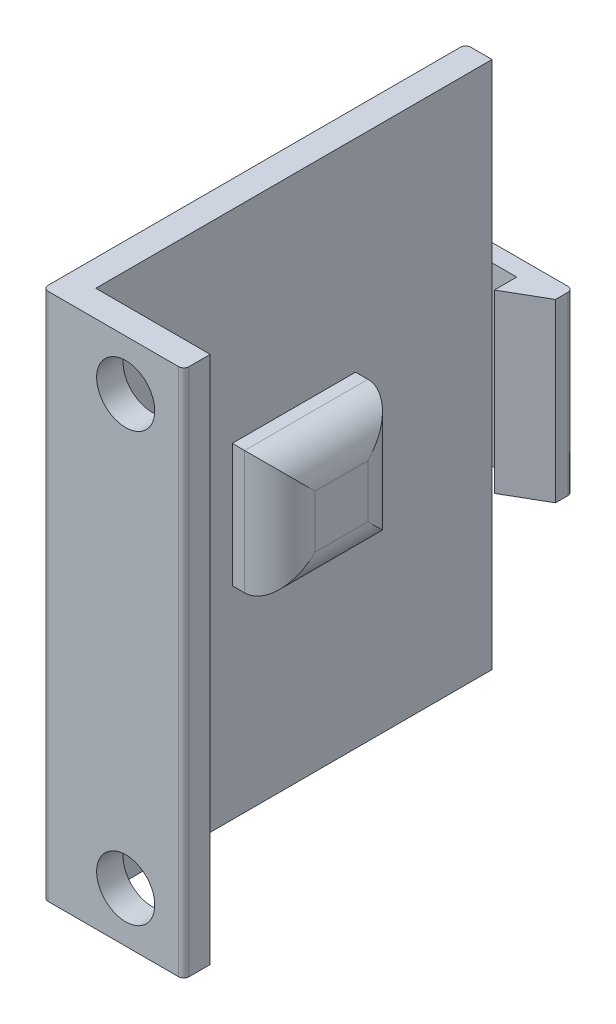
ISO-10303-21;
HEADER;
FILE_DESCRIPTION(('STEP AP214'),'2;1');
FILE_NAME('part.step','',(''),(''),'','','');
FILE_SCHEMA(('AUTOMOTIVE_DESIGN { 1 0 10303 214 1 1 1 1 }'));
ENDSEC;
DATA;
#1=APPLICATION_CONTEXT('core data for automotive mechanical design processes');
#2=APPLICATION_PROTOCOL_DEFINITION('international standard','automotive_design',2000,#1);
#3=PRODUCT_CONTEXT('',#1,'mechanical');
#4=PRODUCT('Part','Part','',(#3));
#5=PRODUCT_RELATED_PRODUCT_CATEGORY('part','',(#4));
#6=PRODUCT_DEFINITION_FORMATION('','',#4);
#7=PRODUCT_DEFINITION_CONTEXT('part definition',#1,'design');
#8=PRODUCT_DEFINITION('design','',#6,#7);
#9=PRODUCT_DEFINITION_SHAPE('','',#8);
#10=(LENGTH_UNIT() NAMED_UNIT(*) SI_UNIT(.MILLI.,.METRE.));
#11=(NAMED_UNIT(*) PLANE_ANGLE_UNIT() SI_UNIT($,.RADIAN.));
#12=(NAMED_UNIT(*) SI_UNIT($,.STERADIAN.) SOLID_ANGLE_UNIT());
#13=UNCERTAINTY_MEASURE_WITH_UNIT(LENGTH_MEASURE(1.E-05),#10,'distance_accuracy_value','');
#14=(GEOMETRIC_REPRESENTATION_CONTEXT(3) GLOBAL_UNCERTAINTY_ASSIGNED_CONTEXT((#13)) GLOBAL_UNIT_ASSIGNED_CONTEXT((#10,
#11,#12)) REPRESENTATION_CONTEXT('',''));
#15=CARTESIAN_POINT('',(0.,0.,0.));
#16=DIRECTION('',(0.,0.,1.));
#17=DIRECTION('',(1.,0.,0.));
#18=AXIS2_PLACEMENT_3D('',#15,#16,#17);
#19=CARTESIAN_POINT('',(-3.6,0.,0.));
#20=DIRECTION('',(-1.,0.,0.));
#21=DIRECTION('',(0.,0.,1.));
#22=AXIS2_PLACEMENT_3D('',#19,#20,#21);
#23=PLANE('',#22);
#24=DIRECTION('',(0.,1.,0.));
#25=VECTOR('',#24,1.);
#26=CARTESIAN_POINT('',(-3.6,0.,0.));
#27=LINE('',#26,#25);
#28=CARTESIAN_POINT('',(-3.6,-15.,0.));
#29=VERTEX_POINT('',#28);
#30=CARTESIAN_POINT('',(-3.6,-5.,0.));
#31=VERTEX_POINT('',#30);
#32=EDGE_CURVE('E270',#29,#31,#27,.T.);
#33=ORIENTED_EDGE('',*,*,#32,.T.);
#34=DIRECTION('',(0.,1.,0.));
#35=VECTOR('',#34,1.);
#36=CARTESIAN_POINT('',(-3.6,-5.,0.));
#37=LINE('',#36,#35);
#38=CARTESIAN_POINT('',(-3.6,5.,0.));
#39=VERTEX_POINT('',#38);
#40=EDGE_CURVE('E307',#31,#39,#37,.T.);
#41=ORIENTED_EDGE('',*,*,#40,.T.);
#42=CARTESIAN_POINT('',(-3.6,15.,0.));
#43=VERTEX_POINT('',#42);
#44=EDGE_CURVE('E286',#39,#43,#27,.T.);
#45=ORIENTED_EDGE('',*,*,#44,.T.);
#46=DIRECTION('',(0.,0.,1.));
#47=VECTOR('',#46,1.);
#48=CARTESIAN_POINT('',(-3.6,15.,0.));
#49=LINE('',#48,#47);
#50=CARTESIAN_POINT('',(-3.6,15.,22.5));
#51=VERTEX_POINT('',#50);
#52=EDGE_CURVE('E284',#43,#51,#49,.T.);
#53=ORIENTED_EDGE('',*,*,#52,.T.);
#54=DIRECTION('',(0.,1.,0.));
#55=VECTOR('',#54,1.);
#56=CARTESIAN_POINT('',(-3.6,0.,22.5));
#57=LINE('',#56,#55);
#58=CARTESIAN_POINT('',(-3.6,-15.,22.5));
#59=VERTEX_POINT('',#58);
#60=EDGE_CURVE('E281',#59,#51,#57,.T.);
#61=ORIENTED_EDGE('',*,*,#60,.F.);
#62=DIRECTION('',(0.,0.,1.));
#63=VECTOR('',#62,1.);
#64=CARTESIAN_POINT('',(-3.6,-15.,0.));
#65=LINE('',#64,#63);
#66=EDGE_CURVE('E265',#29,#59,#65,.T.);
#67=ORIENTED_EDGE('',*,*,#66,.F.);
#68=EDGE_LOOP('',(#33,#41,#45,#53,#61,#67));
#69=FACE_BOUND('',#68,.T.);
#70=DIRECTION('',(0.,0.,-1.));
#71=VECTOR('',#70,1.);
#72=CARTESIAN_POINT('',(-3.6,-3.5,14.75));
#73=LINE('',#72,#71);
#74=CARTESIAN_POINT('',(-3.6,-3.5,14.75));
#75=VERTEX_POINT('',#74);
#76=CARTESIAN_POINT('',(-3.6,-3.5,7.75));
#77=VERTEX_POINT('',#76);
#78=EDGE_CURVE('E206',#75,#77,#73,.T.);
#79=ORIENTED_EDGE('',*,*,#78,.F.);
#80=DIRECTION('',(0.,-1.,0.));
#81=VECTOR('',#80,1.);
#82=CARTESIAN_POINT('',(-3.6,3.5,14.75));
#83=LINE('',#82,#81);
#84=CARTESIAN_POINT('',(-3.6,3.5,14.75));
#85=VERTEX_POINT('',#84);
#86=EDGE_CURVE('E213',#85,#75,#83,.T.);
#87=ORIENTED_EDGE('',*,*,#86,.F.);
#88=DIRECTION('',(0.,0.,-1.));
#89=VECTOR('',#88,1.);
#90=CARTESIAN_POINT('',(-3.6,3.5,14.75));
#91=LINE('',#90,#89);
#92=CARTESIAN_POINT('',(-3.6,3.5,7.75));
#93=VERTEX_POINT('',#92);
#94=EDGE_CURVE('E224',#85,#93,#91,.T.);
#95=ORIENTED_EDGE('',*,*,#94,.T.);
#96=DIRECTION('',(0.,-1.,0.));
#97=VECTOR('',#96,1.);
#98=CARTESIAN_POINT('',(-3.6,3.5,7.75));
#99=LINE('',#98,#97);
#100=EDGE_CURVE('E221',#93,#77,#99,.T.);
#101=ORIENTED_EDGE('',*,*,#100,.T.);
#102=EDGE_LOOP('',(#79,#87,#95,#101));
#103=FACE_BOUND('',#102,.T.);
#104=ADVANCED_FACE('F35',(#69,#103),#23,.F.);
#105=CARTESIAN_POINT('',(-2.2,-5.,1.27017059221719));
#106=DIRECTION('',(0.500000000000004,0.,0.866025403784436));
#107=DIRECTION('',(0.866025403784436,0.,-0.500000000000004));
#108=AXIS2_PLACEMENT_3D('',#105,#106,#107);
#109=PLANE('',#108);
#110=DIRECTION('',(0.,1.,0.));
#111=VECTOR('',#110,1.);
#112=CARTESIAN_POINT('',(0.,-5.,0.));
#113=LINE('',#112,#111);
#114=CARTESIAN_POINT('',(0.,-5.,0.));
#115=VERTEX_POINT('',#114);
#116=CARTESIAN_POINT('',(0.,5.,0.));
#117=VERTEX_POINT('',#116);
#118=EDGE_CURVE('E327',#115,#117,#113,.T.);
#119=ORIENTED_EDGE('',*,*,#118,.T.);
#120=DIRECTION('',(0.866025403784436,0.,-0.500000000000004));
#121=VECTOR('',#120,1.);
#122=CARTESIAN_POINT('',(-2.2,5.,1.27017059221719));
#123=LINE('',#122,#121);
#124=CARTESIAN_POINT('',(-2.2,5.,1.27017059221719));
#125=VERTEX_POINT('',#124);
#126=EDGE_CURVE('E315',#125,#117,#123,.T.);
#127=ORIENTED_EDGE('',*,*,#126,.F.);
#128=DIRECTION('',(0.,1.,0.));
#129=VECTOR('',#128,1.);
#130=CARTESIAN_POINT('',(-2.2,-5.,1.27017059221719));
#131=LINE('',#130,#129);
#132=CARTESIAN_POINT('',(-2.2,-5.,1.27017059221719));
#133=VERTEX_POINT('',#132);
#134=EDGE_CURVE('E328',#133,#125,#131,.T.);
#135=ORIENTED_EDGE('',*,*,#134,.F.);
#136=DIRECTION('',(0.866025403784436,0.,-0.500000000000004));
#137=VECTOR('',#136,1.);
#138=CARTESIAN_POINT('',(-2.2,-5.,1.27017059221719));
#139=LINE('',#138,#137);
#140=EDGE_CURVE('E321',#133,#115,#139,.T.);
#141=ORIENTED_EDGE('',*,*,#140,.T.);
#142=EDGE_LOOP('',(#119,#127,#135,#141));
#143=FACE_BOUND('',#142,.T.);
#144=ADVANCED_FACE('F437',(#143),#109,.T.);
#145=CARTESIAN_POINT('',(-2.2,-5.,0.));
#146=DIRECTION('',(-1.,0.,0.));
#147=DIRECTION('',(0.,0.,1.));
#148=AXIS2_PLACEMENT_3D('',#145,#146,#147);
#149=PLANE('',#148);
#150=ORIENTED_EDGE('',*,*,#134,.T.);
#151=DIRECTION('',(0.,0.,1.));
#152=VECTOR('',#151,1.);
#153=CARTESIAN_POINT('',(-2.2,5.,0.));
#154=LINE('',#153,#152);
#155=CARTESIAN_POINT('',(-2.2,5.,0.));
#156=VERTEX_POINT('',#155);
#157=EDGE_CURVE('E318',#156,#125,#154,.T.);
#158=ORIENTED_EDGE('',*,*,#157,.F.);
#159=DIRECTION('',(0.,1.,0.));
#160=VECTOR('',#159,1.);
#161=CARTESIAN_POINT('',(-2.2,-5.,0.));
#162=LINE('',#161,#160);
#163=CARTESIAN_POINT('',(-2.2,-5.,0.));
#164=VERTEX_POINT('',#163);
#165=EDGE_CURVE('E331',#164,#156,#162,.T.);
#166=ORIENTED_EDGE('',*,*,#165,.F.);
#167=DIRECTION('',(0.,0.,1.));
#168=VECTOR('',#167,1.);
#169=CARTESIAN_POINT('',(-2.2,-5.,0.));
#170=LINE('',#169,#168);
#171=EDGE_CURVE('E324',#164,#133,#170,.T.);
#172=ORIENTED_EDGE('',*,*,#171,.T.);
#173=EDGE_LOOP('',(#150,#158,#166,#172));
#174=FACE_BOUND('',#173,.T.);
#175=ADVANCED_FACE('F443',(#174),#149,.T.);
#176=CARTESIAN_POINT('',(0.,-5.,0.));
#177=DIRECTION('',(0.,-1.,0.));
#178=DIRECTION('',(0.,0.,-1.));
#179=AXIS2_PLACEMENT_3D('',#176,#177,#178);
#180=PLANE('',#179);
#181=DIRECTION('',(-1.,0.,0.));
#182=VECTOR('',#181,1.);
#183=CARTESIAN_POINT('',(0.,-5.,-1.));
#184=LINE('',#183,#182);
#185=CARTESIAN_POINT('',(-0.3,-5.,-1.));
#186=VERTEX_POINT('',#185);
#187=CARTESIAN_POINT('',(-4.8,-5.,-0.999999999999999));
#188=VERTEX_POINT('',#187);
#189=EDGE_CURVE('E297',#186,#188,#184,.T.);
#190=ORIENTED_EDGE('',*,*,#189,.F.);
#191=CARTESIAN_POINT('',(-0.3,-5.,-0.7));
#192=DIRECTION('',(0.,-1.,0.));
#193=DIRECTION('',(0.,0.,-1.));
#194=AXIS2_PLACEMENT_3D('',#191,#192,#193);
#195=CIRCLE('',#194,0.3);
#196=CARTESIAN_POINT('',(0.,-5.,-0.7));
#197=VERTEX_POINT('',#196);
#198=EDGE_CURVE('E342',#186,#197,#195,.T.);
#199=ORIENTED_EDGE('',*,*,#198,.T.);
#200=DIRECTION('',(0.,0.,1.));
#201=VECTOR('',#200,1.);
#202=CARTESIAN_POINT('',(0.,-5.,-1.));
#203=LINE('',#202,#201);
#204=EDGE_CURVE('E313',#197,#115,#203,.T.);
#205=ORIENTED_EDGE('',*,*,#204,.T.);
#206=ORIENTED_EDGE('',*,*,#140,.F.);
#207=ORIENTED_EDGE('',*,*,#171,.F.);
#208=DIRECTION('',(-1.,0.,0.));
#209=VECTOR('',#208,1.);
#210=CARTESIAN_POINT('',(0.,-5.,0.));
#211=LINE('',#210,#209);
#212=EDGE_CURVE('E296',#164,#31,#211,.T.);
#213=ORIENTED_EDGE('',*,*,#212,.T.);
#214=DIRECTION('',(1.,0.,0.));
#215=VECTOR('',#214,1.);
#216=CARTESIAN_POINT('',(-5.1,-5.,0.));
#217=LINE('',#216,#215);
#218=CARTESIAN_POINT('',(-4.8,-5.,0.));
#219=VERTEX_POINT('',#218);
#220=EDGE_CURVE('E290',#219,#31,#217,.T.);
#221=ORIENTED_EDGE('',*,*,#220,.F.);
#222=CARTESIAN_POINT('',(-4.8,-5.,0.3));
#223=DIRECTION('',(0.,-1.,0.));
#224=DIRECTION('',(0.,0.,-1.));
#225=AXIS2_PLACEMENT_3D('',#222,#223,#224);
#226=CIRCLE('',#225,0.3);
#227=CARTESIAN_POINT('',(-5.1,-5.,0.300000000000001));
#228=VERTEX_POINT('',#227);
#229=EDGE_CURVE('E386',#219,#228,#226,.F.);
#230=ORIENTED_EDGE('',*,*,#229,.T.);
#231=DIRECTION('',(0.,0.,1.));
#232=VECTOR('',#231,1.);
#233=CARTESIAN_POINT('',(-5.1,-5.,0.));
#234=LINE('',#233,#232);
#235=CARTESIAN_POINT('',(-5.1,-5.,-0.7));
#236=VERTEX_POINT('',#235);
#237=EDGE_CURVE('E276',#236,#228,#234,.T.);
#238=ORIENTED_EDGE('',*,*,#237,.F.);
#239=CARTESIAN_POINT('',(-4.8,-5.,-0.7));
#240=DIRECTION('',(0.,-1.,0.));
#241=DIRECTION('',(0.,0.,-1.));
#242=AXIS2_PLACEMENT_3D('',#239,#240,#241);
#243=CIRCLE('',#242,0.3);
#244=EDGE_CURVE('E340',#236,#188,#243,.T.);
#245=ORIENTED_EDGE('',*,*,#244,.T.);
#246=EDGE_LOOP('',(#190,#199,#205,#206,#207,#213,#221,#230,#238,#245));
#247=FACE_BOUND('',#246,.T.);
#248=ADVANCED_FACE('F479',(#247),#180,.T.);
#249=CARTESIAN_POINT('',(0.,5.,0.));
#250=DIRECTION('',(0.,-1.,0.));
#251=DIRECTION('',(0.,0.,-1.));
#252=AXIS2_PLACEMENT_3D('',#249,#250,#251);
#253=PLANE('',#252);
#254=DIRECTION('',(0.,0.,1.));
#255=VECTOR('',#254,1.);
#256=CARTESIAN_POINT('',(0.,5.,-1.));
#257=LINE('',#256,#255);
#258=CARTESIAN_POINT('',(0.,5.,-0.7));
#259=VERTEX_POINT('',#258);
#260=EDGE_CURVE('E304',#259,#117,#257,.T.);
#261=ORIENTED_EDGE('',*,*,#260,.F.);
#262=CARTESIAN_POINT('',(-0.3,5.,-0.7));
#263=DIRECTION('',(0.,-1.,0.));
#264=DIRECTION('',(0.,0.,-1.));
#265=AXIS2_PLACEMENT_3D('',#262,#263,#264);
#266=CIRCLE('',#265,0.3);
#267=CARTESIAN_POINT('',(-0.3,5.,-1.));
#268=VERTEX_POINT('',#267);
#269=EDGE_CURVE('E348',#259,#268,#266,.F.);
#270=ORIENTED_EDGE('',*,*,#269,.T.);
#271=DIRECTION('',(1.,0.,0.));
#272=VECTOR('',#271,1.);
#273=CARTESIAN_POINT('',(0.,5.,-1.));
#274=LINE('',#273,#272);
#275=CARTESIAN_POINT('',(-4.8,5.,-0.999999999999999));
#276=VERTEX_POINT('',#275);
#277=EDGE_CURVE('E300',#276,#268,#274,.T.);
#278=ORIENTED_EDGE('',*,*,#277,.F.);
#279=CARTESIAN_POINT('',(-4.8,5.,-0.7));
#280=DIRECTION('',(0.,-1.,0.));
#281=DIRECTION('',(0.,0.,-1.));
#282=AXIS2_PLACEMENT_3D('',#279,#280,#281);
#283=CIRCLE('',#282,0.3);
#284=CARTESIAN_POINT('',(-5.1,5.,-0.7));
#285=VERTEX_POINT('',#284);
#286=EDGE_CURVE('E346',#276,#285,#283,.F.);
#287=ORIENTED_EDGE('',*,*,#286,.T.);
#288=DIRECTION('',(0.,0.,-1.));
#289=VECTOR('',#288,1.);
#290=CARTESIAN_POINT('',(-5.1,5.,0.));
#291=LINE('',#290,#289);
#292=CARTESIAN_POINT('',(-5.1,5.,0.300000000000001));
#293=VERTEX_POINT('',#292);
#294=EDGE_CURVE('E273',#293,#285,#291,.T.);
#295=ORIENTED_EDGE('',*,*,#294,.F.);
#296=CARTESIAN_POINT('',(-4.8,5.,0.3));
#297=DIRECTION('',(0.,-1.,0.));
#298=DIRECTION('',(0.,0.,-1.));
#299=AXIS2_PLACEMENT_3D('',#296,#297,#298);
#300=CIRCLE('',#299,0.3);
#301=CARTESIAN_POINT('',(-4.8,5.,0.));
#302=VERTEX_POINT('',#301);
#303=EDGE_CURVE('E389',#293,#302,#300,.T.);
#304=ORIENTED_EDGE('',*,*,#303,.T.);
#305=DIRECTION('',(1.,0.,0.));
#306=VECTOR('',#305,1.);
#307=CARTESIAN_POINT('',(-5.1,5.,0.));
#308=LINE('',#307,#306);
#309=EDGE_CURVE('E292',#302,#39,#308,.T.);
#310=ORIENTED_EDGE('',*,*,#309,.T.);
#311=DIRECTION('',(1.,0.,0.));
#312=VECTOR('',#311,1.);
#313=CARTESIAN_POINT('',(0.,5.,0.));
#314=LINE('',#313,#312);
#315=EDGE_CURVE('E301',#39,#156,#314,.T.);
#316=ORIENTED_EDGE('',*,*,#315,.T.);
#317=ORIENTED_EDGE('',*,*,#157,.T.);
#318=ORIENTED_EDGE('',*,*,#126,.T.);
#319=EDGE_LOOP('',(#261,#270,#278,#287,#295,#304,#310,#316,#317,#318));
#320=FACE_BOUND('',#319,.T.);
#321=ADVANCED_FACE('F475',(#320),#253,.F.);
#322=CARTESIAN_POINT('',(0.,-5.,-1.));
#323=DIRECTION('',(-1.,0.,0.));
#324=DIRECTION('',(0.,0.,1.));
#325=AXIS2_PLACEMENT_3D('',#322,#323,#324);
#326=PLANE('',#325);
#327=ORIENTED_EDGE('',*,*,#204,.F.);
#328=DIRECTION('',(0.,-1.,0.));
#329=VECTOR('',#328,1.);
#330=CARTESIAN_POINT('',(0.,-5.,-0.7));
#331=LINE('',#330,#329);
#332=EDGE_CURVE('E344',#197,#259,#331,.F.);
#333=ORIENTED_EDGE('',*,*,#332,.T.);
#334=ORIENTED_EDGE('',*,*,#260,.T.);
#335=ORIENTED_EDGE('',*,*,#118,.F.);
#336=EDGE_LOOP('',(#327,#333,#334,#335));
#337=FACE_BOUND('',#336,.T.);
#338=ADVANCED_FACE('F468',(#337),#326,.F.);
#339=CARTESIAN_POINT('',(0.,0.,-1.));
#340=DIRECTION('',(0.,0.,1.));
#341=DIRECTION('',(1.,0.,0.));
#342=AXIS2_PLACEMENT_3D('',#339,#340,#341);
#343=PLANE('',#342);
#344=ORIENTED_EDGE('',*,*,#277,.T.);
#345=DIRECTION('',(0.,-1.,0.));
#346=VECTOR('',#345,1.);
#347=CARTESIAN_POINT('',(-0.3,0.,-1.));
#348=LINE('',#347,#346);
#349=EDGE_CURVE('E337',#268,#186,#348,.T.);
#350=ORIENTED_EDGE('',*,*,#349,.T.);
#351=ORIENTED_EDGE('',*,*,#189,.T.);
#352=DIRECTION('',(0.,-1.,0.));
#353=VECTOR('',#352,1.);
#354=CARTESIAN_POINT('',(-4.8,5.,-0.999999999999999));
#355=LINE('',#354,#353);
#356=EDGE_CURVE('E330',#188,#276,#355,.F.);
#357=ORIENTED_EDGE('',*,*,#356,.T.);
#358=EDGE_LOOP('',(#344,#350,#351,#357));
#359=FACE_BOUND('',#358,.T.);
#360=ADVANCED_FACE('F465',(#359),#343,.F.);
#361=CARTESIAN_POINT('',(0.,0.,0.));
#362=DIRECTION('',(0.,0.,1.));
#363=DIRECTION('',(1.,0.,0.));
#364=AXIS2_PLACEMENT_3D('',#361,#362,#363);
#365=PLANE('',#364);
#366=ORIENTED_EDGE('',*,*,#212,.F.);
#367=ORIENTED_EDGE('',*,*,#165,.T.);
#368=ORIENTED_EDGE('',*,*,#315,.F.);
#369=ORIENTED_EDGE('',*,*,#40,.F.);
#370=EDGE_LOOP('',(#366,#367,#368,#369));
#371=FACE_BOUND('',#370,.T.);
#372=ADVANCED_FACE('F463',(#371),#365,.T.);
#373=CARTESIAN_POINT('',(-5.1,-15.,0.));
#374=DIRECTION('',(0.,1.,0.));
#375=DIRECTION('',(0.,0.,1.));
#376=AXIS2_PLACEMENT_3D('',#373,#374,#375);
#377=PLANE('',#376);
#378=DIRECTION('',(0.,0.,1.));
#379=VECTOR('',#378,1.);
#380=CARTESIAN_POINT('',(-5.1,-15.,0.));
#381=LINE('',#380,#379);
#382=CARTESIAN_POINT('',(-5.1,-15.,0.300000000000001));
#383=VERTEX_POINT('',#382);
#384=CARTESIAN_POINT('',(-5.1,-15.,23.7));
#385=VERTEX_POINT('',#384);
#386=EDGE_CURVE('E266',#383,#385,#381,.T.);
#387=ORIENTED_EDGE('',*,*,#386,.F.);
#388=CARTESIAN_POINT('',(-4.8,-15.,0.3));
#389=DIRECTION('',(0.,1.,0.));
#390=DIRECTION('',(0.,0.,1.));
#391=AXIS2_PLACEMENT_3D('',#388,#389,#390);
#392=CIRCLE('',#391,0.3);
#393=CARTESIAN_POINT('',(-4.8,-15.,0.));
#394=VERTEX_POINT('',#393);
#395=EDGE_CURVE('E367',#383,#394,#392,.F.);
#396=ORIENTED_EDGE('',*,*,#395,.T.);
#397=DIRECTION('',(1.,0.,0.));
#398=VECTOR('',#397,1.);
#399=CARTESIAN_POINT('',(-5.1,-15.,0.));
#400=LINE('',#399,#398);
#401=EDGE_CURVE('E278',#394,#29,#400,.T.);
#402=ORIENTED_EDGE('',*,*,#401,.T.);
#403=ORIENTED_EDGE('',*,*,#66,.T.);
#404=DIRECTION('',(1.,0.,0.));
#405=VECTOR('',#404,1.);
#406=CARTESIAN_POINT('',(0.,-15.,22.5));
#407=LINE('',#406,#405);
#408=CARTESIAN_POINT('',(2.9,-15.,22.5));
#409=VERTEX_POINT('',#408);
#410=EDGE_CURVE('E234',#59,#409,#407,.T.);
#411=ORIENTED_EDGE('',*,*,#410,.T.);
#412=DIRECTION('',(0.,0.,-1.));
#413=VECTOR('',#412,1.);
#414=CARTESIAN_POINT('',(2.9,-15.,24.));
#415=LINE('',#414,#413);
#416=CARTESIAN_POINT('',(2.9,-15.,23.7));
#417=VERTEX_POINT('',#416);
#418=EDGE_CURVE('E263',#417,#409,#415,.T.);
#419=ORIENTED_EDGE('',*,*,#418,.F.);
#420=CARTESIAN_POINT('',(2.6,-15.,23.7));
#421=DIRECTION('',(0.,1.,0.));
#422=DIRECTION('',(0.,0.,1.));
#423=AXIS2_PLACEMENT_3D('',#420,#421,#422);
#424=CIRCLE('',#423,0.3);
#425=CARTESIAN_POINT('',(2.6,-15.,24.));
#426=VERTEX_POINT('',#425);
#427=EDGE_CURVE('E365',#417,#426,#424,.F.);
#428=ORIENTED_EDGE('',*,*,#427,.T.);
#429=DIRECTION('',(1.,0.,0.));
#430=VECTOR('',#429,1.);
#431=CARTESIAN_POINT('',(0.,-15.,24.));
#432=LINE('',#431,#430);
#433=CARTESIAN_POINT('',(-4.8,-15.,24.));
#434=VERTEX_POINT('',#433);
#435=EDGE_CURVE('E235',#434,#426,#432,.T.);
#436=ORIENTED_EDGE('',*,*,#435,.F.);
#437=CARTESIAN_POINT('',(-4.8,-15.,23.7));
#438=DIRECTION('',(0.,1.,0.));
#439=DIRECTION('',(0.,0.,1.));
#440=AXIS2_PLACEMENT_3D('',#437,#438,#439);
#441=CIRCLE('',#440,0.3);
#442=EDGE_CURVE('E363',#434,#385,#441,.F.);
#443=ORIENTED_EDGE('',*,*,#442,.T.);
#444=EDGE_LOOP('',(#387,#396,#402,#403,#411,#419,#428,#436,#443));
#445=FACE_BOUND('',#444,.T.);
#446=ADVANCED_FACE('F459',(#445),#377,.F.);
#447=CARTESIAN_POINT('',(-5.1,15.,0.));
#448=DIRECTION('',(0.,1.,0.));
#449=DIRECTION('',(0.,0.,1.));
#450=AXIS2_PLACEMENT_3D('',#447,#448,#449);
#451=PLANE('',#450);
#452=DIRECTION('',(1.,0.,0.));
#453=VECTOR('',#452,1.);
#454=CARTESIAN_POINT('',(-5.1,15.,0.));
#455=LINE('',#454,#453);
#456=CARTESIAN_POINT('',(-4.8,15.,0.));
#457=VERTEX_POINT('',#456);
#458=EDGE_CURVE('E294',#457,#43,#455,.T.);
#459=ORIENTED_EDGE('',*,*,#458,.F.);
#460=CARTESIAN_POINT('',(-4.8,15.,0.3));
#461=DIRECTION('',(0.,1.,0.));
#462=DIRECTION('',(0.,0.,1.));
#463=AXIS2_PLACEMENT_3D('',#460,#461,#462);
#464=CIRCLE('',#463,0.3);
#465=CARTESIAN_POINT('',(-5.1,15.,0.300000000000001));
#466=VERTEX_POINT('',#465);
#467=EDGE_CURVE('E376',#457,#466,#464,.T.);
#468=ORIENTED_EDGE('',*,*,#467,.T.);
#469=DIRECTION('',(0.,0.,1.));
#470=VECTOR('',#469,1.);
#471=CARTESIAN_POINT('',(-5.1,15.,0.));
#472=LINE('',#471,#470);
#473=CARTESIAN_POINT('',(-5.1,15.,23.7));
#474=VERTEX_POINT('',#473);
#475=EDGE_CURVE('E269',#466,#474,#472,.T.);
#476=ORIENTED_EDGE('',*,*,#475,.T.);
#477=CARTESIAN_POINT('',(-4.8,15.,23.7));
#478=DIRECTION('',(0.,1.,0.));
#479=DIRECTION('',(0.,0.,1.));
#480=AXIS2_PLACEMENT_3D('',#477,#478,#479);
#481=CIRCLE('',#480,0.3);
#482=CARTESIAN_POINT('',(-4.8,15.,24.));
#483=VERTEX_POINT('',#482);
#484=EDGE_CURVE('E372',#474,#483,#481,.T.);
#485=ORIENTED_EDGE('',*,*,#484,.T.);
#486=DIRECTION('',(1.,0.,0.));
#487=VECTOR('',#486,1.);
#488=CARTESIAN_POINT('',(0.,15.,24.));
#489=LINE('',#488,#487);
#490=CARTESIAN_POINT('',(2.6,15.,24.));
#491=VERTEX_POINT('',#490);
#492=EDGE_CURVE('E238',#483,#491,#489,.T.);
#493=ORIENTED_EDGE('',*,*,#492,.T.);
#494=CARTESIAN_POINT('',(2.6,15.,23.7));
#495=DIRECTION('',(0.,1.,0.));
#496=DIRECTION('',(0.,0.,1.));
#497=AXIS2_PLACEMENT_3D('',#494,#495,#496);
#498=CIRCLE('',#497,0.3);
#499=CARTESIAN_POINT('',(2.9,15.,23.7));
#500=VERTEX_POINT('',#499);
#501=EDGE_CURVE('E374',#491,#500,#498,.T.);
#502=ORIENTED_EDGE('',*,*,#501,.T.);
#503=DIRECTION('',(0.,0.,-1.));
#504=VECTOR('',#503,1.);
#505=CARTESIAN_POINT('',(2.9,15.,24.));
#506=LINE('',#505,#504);
#507=CARTESIAN_POINT('',(2.9,15.,22.5));
#508=VERTEX_POINT('',#507);
#509=EDGE_CURVE('E248',#500,#508,#506,.T.);
#510=ORIENTED_EDGE('',*,*,#509,.T.);
#511=DIRECTION('',(1.,0.,0.));
#512=VECTOR('',#511,1.);
#513=CARTESIAN_POINT('',(0.,15.,22.5));
#514=LINE('',#513,#512);
#515=EDGE_CURVE('E254',#51,#508,#514,.T.);
#516=ORIENTED_EDGE('',*,*,#515,.F.);
#517=ORIENTED_EDGE('',*,*,#52,.F.);
#518=EDGE_LOOP('',(#459,#468,#476,#485,#493,#502,#510,#516,#517));
#519=FACE_BOUND('',#518,.T.);
#520=ADVANCED_FACE('F456',(#519),#451,.T.);
#521=CARTESIAN_POINT('',(-5.1,0.,0.));
#522=DIRECTION('',(0.,0.,-1.));
#523=DIRECTION('',(-1.,0.,0.));
#524=AXIS2_PLACEMENT_3D('',#521,#522,#523);
#525=PLANE('',#524);
#526=ORIENTED_EDGE('',*,*,#309,.F.);
#527=DIRECTION('',(0.,1.,0.));
#528=VECTOR('',#527,1.);
#529=CARTESIAN_POINT('',(-4.8,0.,0.));
#530=LINE('',#529,#528);
#531=EDGE_CURVE('E369',#302,#457,#530,.T.);
#532=ORIENTED_EDGE('',*,*,#531,.T.);
#533=ORIENTED_EDGE('',*,*,#458,.T.);
#534=ORIENTED_EDGE('',*,*,#44,.F.);
#535=EDGE_LOOP('',(#526,#532,#533,#534));
#536=FACE_BOUND('',#535,.T.);
#537=ADVANCED_FACE('F454',(#536),#525,.T.);
#538=ORIENTED_EDGE('',*,*,#401,.F.);
#539=DIRECTION('',(0.,1.,0.));
#540=VECTOR('',#539,1.);
#541=CARTESIAN_POINT('',(-4.8,0.,0.));
#542=LINE('',#541,#540);
#543=EDGE_CURVE('E350',#394,#219,#542,.T.);
#544=ORIENTED_EDGE('',*,*,#543,.T.);
#545=ORIENTED_EDGE('',*,*,#220,.T.);
#546=ORIENTED_EDGE('',*,*,#32,.F.);
#547=EDGE_LOOP('',(#538,#544,#545,#546));
#548=FACE_BOUND('',#547,.T.);
#549=ADVANCED_FACE('F451',(#548),#525,.T.);
#550=CARTESIAN_POINT('',(-5.1,0.,0.));
#551=DIRECTION('',(-1.,0.,0.));
#552=DIRECTION('',(0.,0.,1.));
#553=AXIS2_PLACEMENT_3D('',#550,#551,#552);
#554=PLANE('',#553);
#555=ORIENTED_EDGE('',*,*,#237,.T.);
#556=DIRECTION('',(0.,1.,0.));
#557=VECTOR('',#556,1.);
#558=CARTESIAN_POINT('',(-5.1,0.,0.300000000000001));
#559=LINE('',#558,#557);
#560=EDGE_CURVE('E361',#228,#383,#559,.F.);
#561=ORIENTED_EDGE('',*,*,#560,.T.);
#562=ORIENTED_EDGE('',*,*,#386,.T.);
#563=DIRECTION('',(0.,-1.,0.));
#564=VECTOR('',#563,1.);
#565=CARTESIAN_POINT('',(-5.1,0.,23.7));
#566=LINE('',#565,#564);
#567=EDGE_CURVE('E356',#385,#474,#566,.F.);
#568=ORIENTED_EDGE('',*,*,#567,.T.);
#569=ORIENTED_EDGE('',*,*,#475,.F.);
#570=DIRECTION('',(0.,1.,0.));
#571=VECTOR('',#570,1.);
#572=CARTESIAN_POINT('',(-5.1,0.,0.300000000000001));
#573=LINE('',#572,#571);
#574=EDGE_CURVE('E358',#466,#293,#573,.F.);
#575=ORIENTED_EDGE('',*,*,#574,.T.);
#576=ORIENTED_EDGE('',*,*,#294,.T.);
#577=DIRECTION('',(0.,-1.,0.));
#578=VECTOR('',#577,1.);
#579=CARTESIAN_POINT('',(-5.1,-5.,-0.7));
#580=LINE('',#579,#578);
#581=EDGE_CURVE('E353',#285,#236,#580,.T.);
#582=ORIENTED_EDGE('',*,*,#581,.T.);
#583=EDGE_LOOP('',(#555,#561,#562,#568,#569,#575,#576,#582));
#584=FACE_BOUND('',#583,.T.);
#585=ADVANCED_FACE('F449',(#584),#554,.T.);
#586=CARTESIAN_POINT('',(0.,0.,22.5));
#587=DIRECTION('',(0.,0.,1.));
#588=DIRECTION('',(1.,0.,0.));
#589=AXIS2_PLACEMENT_3D('',#586,#587,#588);
#590=PLANE('',#589);
#591=CARTESIAN_POINT('',(-0.399999999999997,12.15,22.5));
#592=DIRECTION('',(0.,0.,1.));
#593=DIRECTION('',(1.,0.,0.));
#594=AXIS2_PLACEMENT_3D('',#591,#592,#593);
#595=CIRCLE('',#594,1.65);
#596=CARTESIAN_POINT('',(1.25,12.15,22.5));
#597=VERTEX_POINT('',#596);
#598=EDGE_CURVE('E257',#597,#597,#595,.T.);
#599=ORIENTED_EDGE('',*,*,#598,.T.);
#600=EDGE_LOOP('',(#599));
#601=FACE_BOUND('',#600,.T.);
#602=CARTESIAN_POINT('',(-0.399999999999997,-12.15,22.5));
#603=DIRECTION('',(0.,0.,1.));
#604=DIRECTION('',(1.,0.,0.));
#605=AXIS2_PLACEMENT_3D('',#602,#603,#604);
#606=CIRCLE('',#605,1.65);
#607=CARTESIAN_POINT('',(1.25,-12.15,22.5));
#608=VERTEX_POINT('',#607);
#609=EDGE_CURVE('E239',#608,#608,#606,.F.);
#610=ORIENTED_EDGE('',*,*,#609,.F.);
#611=EDGE_LOOP('',(#610));
#612=FACE_BOUND('',#611,.T.);
#613=ORIENTED_EDGE('',*,*,#410,.F.);
#614=ORIENTED_EDGE('',*,*,#60,.T.);
#615=ORIENTED_EDGE('',*,*,#515,.T.);
#616=DIRECTION('',(0.,1.,0.));
#617=VECTOR('',#616,1.);
#618=CARTESIAN_POINT('',(2.9,0.,22.5));
#619=LINE('',#618,#617);
#620=EDGE_CURVE('E251',#409,#508,#619,.T.);
#621=ORIENTED_EDGE('',*,*,#620,.F.);
#622=EDGE_LOOP('',(#613,#614,#615,#621));
#623=FACE_BOUND('',#622,.T.);
#624=ADVANCED_FACE('F608',(#601,#612,#623),#590,.F.);
#625=CARTESIAN_POINT('',(2.9,0.,24.));
#626=DIRECTION('',(-1.,0.,0.));
#627=DIRECTION('',(0.,0.,1.));
#628=AXIS2_PLACEMENT_3D('',#625,#626,#627);
#629=PLANE('',#628);
#630=ORIENTED_EDGE('',*,*,#509,.F.);
#631=DIRECTION('',(0.,1.,0.));
#632=VECTOR('',#631,1.);
#633=CARTESIAN_POINT('',(2.9,-15.,23.7));
#634=LINE('',#633,#632);
#635=EDGE_CURVE('E384',#500,#417,#634,.F.);
#636=ORIENTED_EDGE('',*,*,#635,.T.);
#637=ORIENTED_EDGE('',*,*,#418,.T.);
#638=ORIENTED_EDGE('',*,*,#620,.T.);
#639=EDGE_LOOP('',(#630,#636,#637,#638));
#640=FACE_BOUND('',#639,.T.);
#641=ADVANCED_FACE('F602',(#640),#629,.F.);
#642=CARTESIAN_POINT('',(-0.399999999999997,12.15,24.));
#643=DIRECTION('',(0.,0.,-1.));
#644=DIRECTION('',(-1.,0.,0.));
#645=AXIS2_PLACEMENT_3D('',#642,#643,#644);
#646=CYLINDRICAL_SURFACE('',#645,1.65);
#647=CARTESIAN_POINT('',(-0.399999999999997,12.15,24.));
#648=DIRECTION('',(0.,0.,1.));
#649=DIRECTION('',(1.,0.,0.));
#650=AXIS2_PLACEMENT_3D('',#647,#648,#649);
#651=CIRCLE('',#650,1.65);
#652=CARTESIAN_POINT('',(1.25,12.15,24.));
#653=VERTEX_POINT('',#652);
#654=EDGE_CURVE('E242',#653,#653,#651,.T.);
#655=ORIENTED_EDGE('',*,*,#654,.T.);
#656=EDGE_LOOP('',(#655));
#657=FACE_BOUND('',#656,.T.);
#658=ORIENTED_EDGE('',*,*,#598,.F.);
#659=EDGE_LOOP('',(#658));
#660=FACE_BOUND('',#659,.T.);
#661=ADVANCED_FACE('F607',(#657,#660),#646,.F.);
#662=CARTESIAN_POINT('',(-0.399999999999997,-12.15,24.));
#663=DIRECTION('',(0.,0.,-1.));
#664=DIRECTION('',(-1.,0.,0.));
#665=AXIS2_PLACEMENT_3D('',#662,#663,#664);
#666=CYLINDRICAL_SURFACE('',#665,1.65);
#667=CARTESIAN_POINT('',(-0.399999999999997,-12.15,24.));
#668=DIRECTION('',(0.,0.,1.));
#669=DIRECTION('',(1.,0.,0.));
#670=AXIS2_PLACEMENT_3D('',#667,#668,#669);
#671=CIRCLE('',#670,1.65);
#672=CARTESIAN_POINT('',(1.25,-12.15,24.));
#673=VERTEX_POINT('',#672);
#674=EDGE_CURVE('E245',#673,#673,#671,.F.);
#675=ORIENTED_EDGE('',*,*,#674,.F.);
#676=EDGE_LOOP('',(#675));
#677=FACE_BOUND('',#676,.T.);
#678=ORIENTED_EDGE('',*,*,#609,.T.);
#679=EDGE_LOOP('',(#678));
#680=FACE_BOUND('',#679,.T.);
#681=ADVANCED_FACE('F594',(#677,#680),#666,.F.);
#682=CARTESIAN_POINT('',(0.,0.,24.));
#683=DIRECTION('',(0.,0.,1.));
#684=DIRECTION('',(1.,0.,0.));
#685=AXIS2_PLACEMENT_3D('',#682,#683,#684);
#686=PLANE('',#685);
#687=ORIENTED_EDGE('',*,*,#435,.T.);
#688=DIRECTION('',(0.,1.,0.));
#689=VECTOR('',#688,1.);
#690=CARTESIAN_POINT('',(2.6,15.,24.));
#691=LINE('',#690,#689);
#692=EDGE_CURVE('E381',#426,#491,#691,.T.);
#693=ORIENTED_EDGE('',*,*,#692,.T.);
#694=ORIENTED_EDGE('',*,*,#492,.F.);
#695=DIRECTION('',(0.,-1.,0.));
#696=VECTOR('',#695,1.);
#697=CARTESIAN_POINT('',(-4.8,0.,24.));
#698=LINE('',#697,#696);
#699=EDGE_CURVE('E378',#483,#434,#698,.T.);
#700=ORIENTED_EDGE('',*,*,#699,.T.);
#701=EDGE_LOOP('',(#687,#693,#694,#700));
#702=FACE_BOUND('',#701,.T.);
#703=ORIENTED_EDGE('',*,*,#654,.F.);
#704=EDGE_LOOP('',(#703));
#705=FACE_BOUND('',#704,.T.);
#706=ORIENTED_EDGE('',*,*,#674,.T.);
#707=EDGE_LOOP('',(#706));
#708=FACE_BOUND('',#707,.T.);
#709=ADVANCED_FACE('F491',(#702,#705,#708),#686,.T.);
#710=CARTESIAN_POINT('',(-0.3,0.,-0.7));
#711=DIRECTION('',(0.,-1.,0.));
#712=DIRECTION('',(0.,0.,-1.));
#713=AXIS2_PLACEMENT_3D('',#710,#711,#712);
#714=CYLINDRICAL_SURFACE('',#713,0.3);
#715=ORIENTED_EDGE('',*,*,#269,.F.);
#716=ORIENTED_EDGE('',*,*,#332,.F.);
#717=ORIENTED_EDGE('',*,*,#198,.F.);
#718=ORIENTED_EDGE('',*,*,#349,.F.);
#719=EDGE_LOOP('',(#715,#716,#717,#718));
#720=FACE_BOUND('',#719,.T.);
#721=ADVANCED_FACE('F487',(#720),#714,.T.);
#722=CARTESIAN_POINT('',(-4.8,0.,0.3));
#723=DIRECTION('',(0.,1.,0.));
#724=DIRECTION('',(-1.,0.,0.));
#725=AXIS2_PLACEMENT_3D('',#722,#723,#724);
#726=CYLINDRICAL_SURFACE('',#725,0.3);
#727=ORIENTED_EDGE('',*,*,#395,.F.);
#728=ORIENTED_EDGE('',*,*,#560,.F.);
#729=ORIENTED_EDGE('',*,*,#229,.F.);
#730=ORIENTED_EDGE('',*,*,#543,.F.);
#731=EDGE_LOOP('',(#727,#728,#729,#730));
#732=FACE_BOUND('',#731,.T.);
#733=ADVANCED_FACE('F490',(#732),#726,.T.);
#734=CARTESIAN_POINT('',(-4.8,0.,0.3));
#735=DIRECTION('',(0.,1.,0.));
#736=DIRECTION('',(-1.,0.,0.));
#737=AXIS2_PLACEMENT_3D('',#734,#735,#736);
#738=CYLINDRICAL_SURFACE('',#737,0.3);
#739=ORIENTED_EDGE('',*,*,#303,.F.);
#740=ORIENTED_EDGE('',*,*,#574,.F.);
#741=ORIENTED_EDGE('',*,*,#467,.F.);
#742=ORIENTED_EDGE('',*,*,#531,.F.);
#743=EDGE_LOOP('',(#739,#740,#741,#742));
#744=FACE_BOUND('',#743,.T.);
#745=ADVANCED_FACE('F495',(#744),#738,.T.);
#746=CARTESIAN_POINT('',(2.6,0.,23.7));
#747=DIRECTION('',(0.,-1.,0.));
#748=DIRECTION('',(0.,0.,-1.));
#749=AXIS2_PLACEMENT_3D('',#746,#747,#748);
#750=CYLINDRICAL_SURFACE('',#749,0.3);
#751=ORIENTED_EDGE('',*,*,#427,.F.);
#752=ORIENTED_EDGE('',*,*,#635,.F.);
#753=ORIENTED_EDGE('',*,*,#501,.F.);
#754=ORIENTED_EDGE('',*,*,#692,.F.);
#755=EDGE_LOOP('',(#751,#752,#753,#754));
#756=FACE_BOUND('',#755,.T.);
#757=ADVANCED_FACE('F499',(#756),#750,.T.);
#758=CARTESIAN_POINT('',(-4.8,0.,23.7));
#759=DIRECTION('',(0.,-1.,0.));
#760=DIRECTION('',(1.,0.,0.));
#761=AXIS2_PLACEMENT_3D('',#758,#759,#760);
#762=CYLINDRICAL_SURFACE('',#761,0.3);
#763=ORIENTED_EDGE('',*,*,#484,.F.);
#764=ORIENTED_EDGE('',*,*,#567,.F.);
#765=ORIENTED_EDGE('',*,*,#442,.F.);
#766=ORIENTED_EDGE('',*,*,#699,.F.);
#767=EDGE_LOOP('',(#763,#764,#765,#766));
#768=FACE_BOUND('',#767,.T.);
#769=ADVANCED_FACE('F503',(#768),#762,.T.);
#770=CARTESIAN_POINT('',(-4.8,0.,-0.7));
#771=DIRECTION('',(0.,1.,0.));
#772=DIRECTION('',(-1.,0.,0.));
#773=AXIS2_PLACEMENT_3D('',#770,#771,#772);
#774=CYLINDRICAL_SURFACE('',#773,0.3);
#775=ORIENTED_EDGE('',*,*,#286,.F.);
#776=ORIENTED_EDGE('',*,*,#356,.F.);
#777=ORIENTED_EDGE('',*,*,#244,.F.);
#778=ORIENTED_EDGE('',*,*,#581,.F.);
#779=EDGE_LOOP('',(#775,#776,#777,#778));
#780=FACE_BOUND('',#779,.T.);
#781=ADVANCED_FACE('F434',(#780),#774,.T.);
#782=CARTESIAN_POINT('',(-0.899999999999998,-3.5,14.75));
#783=DIRECTION('',(0.,1.,0.));
#784=DIRECTION('',(-1.,0.,0.));
#785=AXIS2_PLACEMENT_3D('',#782,#783,#784);
#786=PLANE('',#785);
#787=DIRECTION('',(-1.,0.,0.));
#788=VECTOR('',#787,1.);
#789=CARTESIAN_POINT('',(-0.899999999999999,-3.5,7.75));
#790=LINE('',#789,#788);
#791=CARTESIAN_POINT('',(-2.9,-3.5,7.75));
#792=VERTEX_POINT('',#791);
#793=EDGE_CURVE('E232',#792,#77,#790,.T.);
#794=ORIENTED_EDGE('',*,*,#793,.F.);
#795=DIRECTION('',(0.,0.,-1.));
#796=VECTOR('',#795,1.);
#797=CARTESIAN_POINT('',(-2.9,-3.5,14.75));
#798=LINE('',#797,#796);
#799=CARTESIAN_POINT('',(-2.9,-3.5,14.75));
#800=VERTEX_POINT('',#799);
#801=EDGE_CURVE('E11',#792,#800,#798,.F.);
#802=ORIENTED_EDGE('',*,*,#801,.T.);
#803=DIRECTION('',(-1.,0.,0.));
#804=VECTOR('',#803,1.);
#805=CARTESIAN_POINT('',(-0.899999999999998,-3.5,14.75));
#806=LINE('',#805,#804);
#807=EDGE_CURVE('E203',#800,#75,#806,.T.);
#808=ORIENTED_EDGE('',*,*,#807,.T.);
#809=ORIENTED_EDGE('',*,*,#78,.T.);
#810=EDGE_LOOP('',(#794,#802,#808,#809));
#811=FACE_BOUND('',#810,.T.);
#812=ADVANCED_FACE('F205',(#811),#786,.F.);
#813=CARTESIAN_POINT('',(-0.899999999999999,3.5,7.75));
#814=DIRECTION('',(0.,0.,-1.));
#815=DIRECTION('',(-1.,0.,0.));
#816=AXIS2_PLACEMENT_3D('',#813,#814,#815);
#817=PLANE('',#816);
#818=DIRECTION('',(-1.,0.,0.));
#819=VECTOR('',#818,1.);
#820=CARTESIAN_POINT('',(-0.899999999999999,3.5,7.75));
#821=LINE('',#820,#819);
#822=CARTESIAN_POINT('',(-2.9,3.5,7.75));
#823=VERTEX_POINT('',#822);
#824=EDGE_CURVE('E230',#823,#93,#821,.T.);
#825=ORIENTED_EDGE('',*,*,#824,.F.);
#826=DIRECTION('',(0.,-1.,0.));
#827=VECTOR('',#826,1.);
#828=CARTESIAN_POINT('',(-2.9,-3.5,7.75));
#829=LINE('',#828,#827);
#830=EDGE_CURVE('E44',#823,#792,#829,.T.);
#831=ORIENTED_EDGE('',*,*,#830,.T.);
#832=ORIENTED_EDGE('',*,*,#793,.T.);
#833=ORIENTED_EDGE('',*,*,#100,.F.);
#834=EDGE_LOOP('',(#825,#831,#832,#833));
#835=FACE_BOUND('',#834,.T.);
#836=ADVANCED_FACE('F426',(#835),#817,.T.);
#837=CARTESIAN_POINT('',(-0.899999999999998,3.5,14.75));
#838=DIRECTION('',(0.,1.,0.));
#839=DIRECTION('',(-1.,0.,0.));
#840=AXIS2_PLACEMENT_3D('',#837,#838,#839);
#841=PLANE('',#840);
#842=DIRECTION('',(-1.,0.,0.));
#843=VECTOR('',#842,1.);
#844=CARTESIAN_POINT('',(-0.899999999999998,3.5,14.75));
#845=LINE('',#844,#843);
#846=CARTESIAN_POINT('',(-2.9,3.5,14.75));
#847=VERTEX_POINT('',#846);
#848=EDGE_CURVE('E212',#847,#85,#845,.T.);
#849=ORIENTED_EDGE('',*,*,#848,.F.);
#850=DIRECTION('',(0.,0.,-1.));
#851=VECTOR('',#850,1.);
#852=CARTESIAN_POINT('',(-2.9,3.5,7.75));
#853=LINE('',#852,#851);
#854=EDGE_CURVE('E59',#847,#823,#853,.T.);
#855=ORIENTED_EDGE('',*,*,#854,.T.);
#856=ORIENTED_EDGE('',*,*,#824,.T.);
#857=ORIENTED_EDGE('',*,*,#94,.F.);
#858=EDGE_LOOP('',(#849,#855,#856,#857));
#859=FACE_BOUND('',#858,.T.);
#860=ADVANCED_FACE('F425',(#859),#841,.T.);
#861=CARTESIAN_POINT('',(-0.899999999999998,3.5,14.75));
#862=DIRECTION('',(0.,0.,-1.));
#863=DIRECTION('',(-1.,0.,0.));
#864=AXIS2_PLACEMENT_3D('',#861,#862,#863);
#865=PLANE('',#864);
#866=ORIENTED_EDGE('',*,*,#807,.F.);
#867=DIRECTION('',(0.,-1.,0.));
#868=VECTOR('',#867,1.);
#869=CARTESIAN_POINT('',(-2.9,3.5,14.75));
#870=LINE('',#869,#868);
#871=EDGE_CURVE('E400',#800,#847,#870,.F.);
#872=ORIENTED_EDGE('',*,*,#871,.T.);
#873=ORIENTED_EDGE('',*,*,#848,.T.);
#874=ORIENTED_EDGE('',*,*,#86,.T.);
#875=EDGE_LOOP('',(#866,#872,#873,#874));
#876=FACE_BOUND('',#875,.T.);
#877=ADVANCED_FACE('F223',(#876),#865,.F.);
#878=CARTESIAN_POINT('',(-0.9,0.,0.));
#879=DIRECTION('',(-1.,0.,0.));
#880=DIRECTION('',(0.,0.,1.));
#881=AXIS2_PLACEMENT_3D('',#878,#879,#880);
#882=PLANE('',#881);
#883=DIRECTION('',(0.,0.,-1.));
#884=VECTOR('',#883,1.);
#885=CARTESIAN_POINT('',(-0.899999999999998,1.5,14.75));
#886=LINE('',#885,#884);
#887=CARTESIAN_POINT('',(-0.899999999999999,1.5,9.75));
#888=VERTEX_POINT('',#887);
#889=CARTESIAN_POINT('',(-0.899999999999998,1.5,12.75));
#890=VERTEX_POINT('',#889);
#891=EDGE_CURVE('E395',#888,#890,#886,.F.);
#892=ORIENTED_EDGE('',*,*,#891,.T.);
#893=DIRECTION('',(0.,-1.,0.));
#894=VECTOR('',#893,1.);
#895=CARTESIAN_POINT('',(-0.899999999999998,0.,12.75));
#896=LINE('',#895,#894);
#897=CARTESIAN_POINT('',(-0.899999999999998,-1.5,12.75));
#898=VERTEX_POINT('',#897);
#899=EDGE_CURVE('E397',#890,#898,#896,.T.);
#900=ORIENTED_EDGE('',*,*,#899,.T.);
#901=DIRECTION('',(0.,0.,-1.));
#902=VECTOR('',#901,1.);
#903=CARTESIAN_POINT('',(-0.9,-1.5,0.));
#904=LINE('',#903,#902);
#905=CARTESIAN_POINT('',(-0.899999999999999,-1.5,9.75));
#906=VERTEX_POINT('',#905);
#907=EDGE_CURVE('E391',#898,#906,#904,.T.);
#908=ORIENTED_EDGE('',*,*,#907,.T.);
#909=DIRECTION('',(0.,-1.,0.));
#910=VECTOR('',#909,1.);
#911=CARTESIAN_POINT('',(-0.899999999999998,3.5,9.75));
#912=LINE('',#911,#910);
#913=EDGE_CURVE('E393',#906,#888,#912,.F.);
#914=ORIENTED_EDGE('',*,*,#913,.T.);
#915=EDGE_LOOP('',(#892,#900,#908,#914));
#916=FACE_BOUND('',#915,.T.);
#917=ADVANCED_FACE('F518',(#916),#882,.F.);
#918=CARTESIAN_POINT('',(-2.9,3.5,9.75));
#919=DIRECTION('',(0.,1.,0.));
#920=DIRECTION('',(0.,0.,1.));
#921=AXIS2_PLACEMENT_3D('',#918,#919,#920);
#922=CYLINDRICAL_SURFACE('',#921,2.);
#923=CARTESIAN_POINT('',(-2.9,-1.5,9.75));
#924=DIRECTION('',(0.,0.707106781186547,-0.707106781186547));
#925=DIRECTION('',(0.,-0.707106781186547,-0.707106781186547));
#926=AXIS2_PLACEMENT_3D('',#923,#924,#925);
#927=ELLIPSE('',#926,2.82842712474619,2.);
#928=EDGE_CURVE('E407',#792,#906,#927,.F.);
#929=ORIENTED_EDGE('',*,*,#928,.F.);
#930=ORIENTED_EDGE('',*,*,#830,.F.);
#931=CARTESIAN_POINT('',(-2.9,1.5,9.75));
#932=DIRECTION('',(0.,0.707106781186547,0.707106781186547));
#933=DIRECTION('',(0.,0.707106781186547,-0.707106781186547));
#934=AXIS2_PLACEMENT_3D('',#931,#932,#933);
#935=ELLIPSE('',#934,2.82842712474619,2.);
#936=EDGE_CURVE('E39',#888,#823,#935,.T.);
#937=ORIENTED_EDGE('',*,*,#936,.F.);
#938=ORIENTED_EDGE('',*,*,#913,.F.);
#939=EDGE_LOOP('',(#929,#930,#937,#938));
#940=FACE_BOUND('',#939,.T.);
#941=ADVANCED_FACE('F37',(#940),#922,.T.);
#942=CARTESIAN_POINT('',(-2.9,1.5,14.75));
#943=DIRECTION('',(0.,0.,1.));
#944=DIRECTION('',(1.,0.,0.));
#945=AXIS2_PLACEMENT_3D('',#942,#943,#944);
#946=CYLINDRICAL_SURFACE('',#945,2.);
#947=ORIENTED_EDGE('',*,*,#936,.T.);
#948=ORIENTED_EDGE('',*,*,#854,.F.);
#949=CARTESIAN_POINT('',(-2.9,1.5,12.75));
#950=DIRECTION('',(0.,-0.707106781186547,0.707106781186547));
#951=DIRECTION('',(0.,0.707106781186547,0.707106781186547));
#952=AXIS2_PLACEMENT_3D('',#949,#950,#951);
#953=ELLIPSE('',#952,2.82842712474619,2.);
#954=EDGE_CURVE('E406',#890,#847,#953,.T.);
#955=ORIENTED_EDGE('',*,*,#954,.F.);
#956=ORIENTED_EDGE('',*,*,#891,.F.);
#957=EDGE_LOOP('',(#947,#948,#955,#956));
#958=FACE_BOUND('',#957,.T.);
#959=ADVANCED_FACE('F416',(#958),#946,.T.);
#960=CARTESIAN_POINT('',(-2.9,-1.5,0.));
#961=DIRECTION('',(0.,0.,-1.));
#962=DIRECTION('',(-1.,0.,0.));
#963=AXIS2_PLACEMENT_3D('',#960,#961,#962);
#964=CYLINDRICAL_SURFACE('',#963,2.);
#965=ORIENTED_EDGE('',*,*,#928,.T.);
#966=ORIENTED_EDGE('',*,*,#907,.F.);
#967=CARTESIAN_POINT('',(-2.9,-1.5,12.75));
#968=DIRECTION('',(0.,-0.707106781186547,-0.707106781186547));
#969=DIRECTION('',(0.,0.707106781186547,-0.707106781186547));
#970=AXIS2_PLACEMENT_3D('',#967,#968,#969);
#971=ELLIPSE('',#970,2.82842712474619,2.);
#972=EDGE_CURVE('E404',#800,#898,#971,.F.);
#973=ORIENTED_EDGE('',*,*,#972,.F.);
#974=ORIENTED_EDGE('',*,*,#801,.F.);
#975=EDGE_LOOP('',(#965,#966,#973,#974));
#976=FACE_BOUND('',#975,.T.);
#977=ADVANCED_FACE('F421',(#976),#964,.T.);
#978=CARTESIAN_POINT('',(-2.9,0.,12.75));
#979=DIRECTION('',(0.,-1.,0.));
#980=DIRECTION('',(0.,0.,-1.));
#981=AXIS2_PLACEMENT_3D('',#978,#979,#980);
#982=CYLINDRICAL_SURFACE('',#981,2.);
#983=ORIENTED_EDGE('',*,*,#954,.T.);
#984=ORIENTED_EDGE('',*,*,#871,.F.);
#985=ORIENTED_EDGE('',*,*,#972,.T.);
#986=ORIENTED_EDGE('',*,*,#899,.F.);
#987=EDGE_LOOP('',(#983,#984,#985,#986));
#988=FACE_BOUND('',#987,.T.);
#989=ADVANCED_FACE('F424',(#988),#982,.T.);
#990=CLOSED_SHELL('',(#104,#144,#175,#248,#321,#338,#360,#372,#446,#520,#537,#549,#585,#624,
#641,#661,#681,#709,#721,#733,#745,#757,#769,#781,#812,#836,#860,#877,#917,#941,#959,#977,#989));
#991=MANIFOLD_SOLID_BREP('B2',#990);
#992=ADVANCED_BREP_SHAPE_REPRESENTATION('',(#18,#991),#14);
#993=SHAPE_DEFINITION_REPRESENTATION(#9,#992);
ENDSEC;
END-ISO-10303-21;
